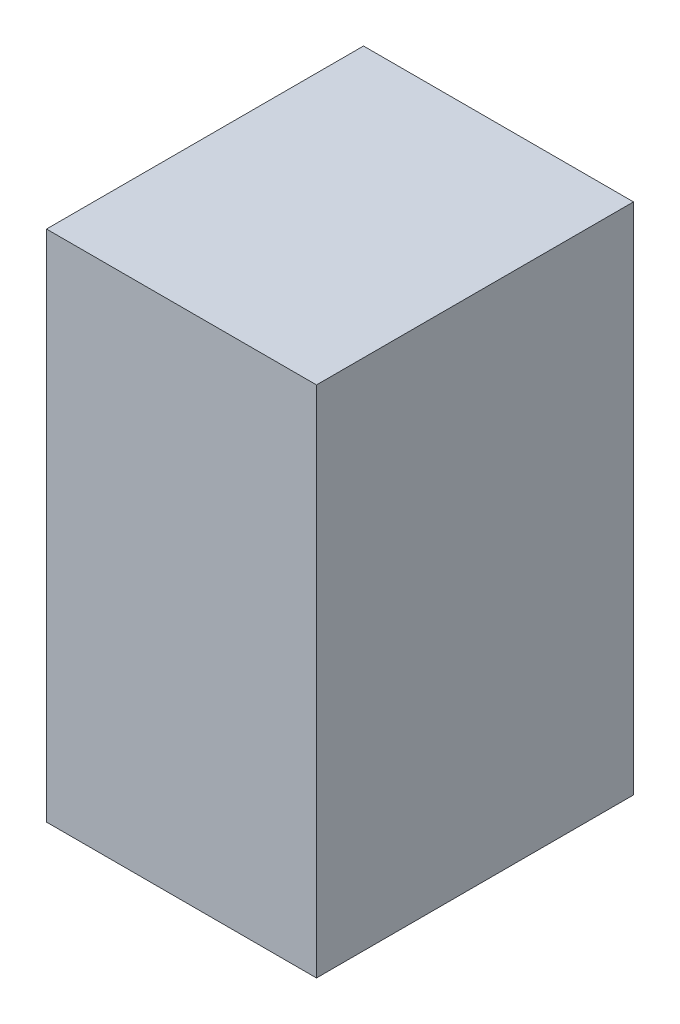
ISO-10303-21;
HEADER;
FILE_DESCRIPTION(('STEP AP214'),'2;1');
FILE_NAME('part.step','',(''),(''),'','','');
FILE_SCHEMA(('AUTOMOTIVE_DESIGN { 1 0 10303 214 1 1 1 1 }'));
ENDSEC;
DATA;
#1=APPLICATION_CONTEXT('core data for automotive mechanical design processes');
#2=APPLICATION_PROTOCOL_DEFINITION('international standard','automotive_design',2000,#1);
#3=PRODUCT_CONTEXT('',#1,'mechanical');
#4=PRODUCT('Part','Part','',(#3));
#5=PRODUCT_RELATED_PRODUCT_CATEGORY('part','',(#4));
#6=PRODUCT_DEFINITION_FORMATION('','',#4);
#7=PRODUCT_DEFINITION_CONTEXT('part definition',#1,'design');
#8=PRODUCT_DEFINITION('design','',#6,#7);
#9=PRODUCT_DEFINITION_SHAPE('','',#8);
#10=(LENGTH_UNIT() NAMED_UNIT(*) SI_UNIT(.MILLI.,.METRE.));
#11=(NAMED_UNIT(*) PLANE_ANGLE_UNIT() SI_UNIT($,.RADIAN.));
#12=(NAMED_UNIT(*) SI_UNIT($,.STERADIAN.) SOLID_ANGLE_UNIT());
#13=UNCERTAINTY_MEASURE_WITH_UNIT(LENGTH_MEASURE(1.E-05),#10,'distance_accuracy_value','');
#14=(GEOMETRIC_REPRESENTATION_CONTEXT(3) GLOBAL_UNCERTAINTY_ASSIGNED_CONTEXT((#13)) GLOBAL_UNIT_ASSIGNED_CONTEXT((#10,
#11,#12)) REPRESENTATION_CONTEXT('',''));
#15=CARTESIAN_POINT('',(0.,0.,0.));
#16=DIRECTION('',(0.,0.,1.));
#17=DIRECTION('',(1.,0.,0.));
#18=AXIS2_PLACEMENT_3D('',#15,#16,#17);
#19=CARTESIAN_POINT('',(35.,33.2917866648596,20.5472745822181));
#20=DIRECTION('',(0.,-1.,0.));
#21=DIRECTION('',(0.,0.,-1.));
#22=AXIS2_PLACEMENT_3D('',#19,#20,#21);
#23=PLANE('',#22);
#24=DIRECTION('',(0.,0.,1.));
#25=VECTOR('',#24,1.);
#26=CARTESIAN_POINT('',(0.,33.2917866648596,20.5472745822181));
#27=LINE('',#26,#25);
#28=CARTESIAN_POINT('',(0.,33.2917866648596,-20.5472745822181));
#29=VERTEX_POINT('',#28);
#30=CARTESIAN_POINT('',(0.,33.2917866648596,20.5472745822181));
#31=VERTEX_POINT('',#30);
#32=EDGE_CURVE('E102',#29,#31,#27,.T.);
#33=ORIENTED_EDGE('',*,*,#32,.T.);
#34=DIRECTION('',(-1.,0.,0.));
#35=VECTOR('',#34,1.);
#36=CARTESIAN_POINT('',(35.,33.2917866648596,20.5472745822181));
#37=LINE('',#36,#35);
#38=CARTESIAN_POINT('',(35.,33.2917866648596,20.5472745822181));
#39=VERTEX_POINT('',#38);
#40=EDGE_CURVE('E11',#39,#31,#37,.T.);
#41=ORIENTED_EDGE('',*,*,#40,.F.);
#42=DIRECTION('',(0.,0.,1.));
#43=VECTOR('',#42,1.);
#44=CARTESIAN_POINT('',(35.,33.2917866648596,20.5472745822181));
#45=LINE('',#44,#43);
#46=CARTESIAN_POINT('',(35.,33.2917866648596,-20.5472745822181));
#47=VERTEX_POINT('',#46);
#48=EDGE_CURVE('E90',#47,#39,#45,.T.);
#49=ORIENTED_EDGE('',*,*,#48,.F.);
#50=DIRECTION('',(-1.,0.,0.));
#51=VECTOR('',#50,1.);
#52=CARTESIAN_POINT('',(35.,33.2917866648596,-20.5472745822181));
#53=LINE('',#52,#51);
#54=EDGE_CURVE('E98',#47,#29,#53,.T.);
#55=ORIENTED_EDGE('',*,*,#54,.T.);
#56=EDGE_LOOP('',(#33,#41,#49,#55));
#57=FACE_BOUND('',#56,.T.);
#58=ADVANCED_FACE('F39',(#57),#23,.F.);
#59=CARTESIAN_POINT('',(35.,-33.2917866648596,20.5472745822181));
#60=DIRECTION('',(0.,0.,-1.));
#61=DIRECTION('',(-1.,0.,0.));
#62=AXIS2_PLACEMENT_3D('',#59,#60,#61);
#63=PLANE('',#62);
#64=DIRECTION('',(0.,-1.,0.));
#65=VECTOR('',#64,1.);
#66=CARTESIAN_POINT('',(0.,-33.2917866648596,20.5472745822181));
#67=LINE('',#66,#65);
#68=CARTESIAN_POINT('',(0.,-33.2917866648596,20.5472745822181));
#69=VERTEX_POINT('',#68);
#70=EDGE_CURVE('E94',#31,#69,#67,.T.);
#71=ORIENTED_EDGE('',*,*,#70,.T.);
#72=DIRECTION('',(-1.,0.,0.));
#73=VECTOR('',#72,1.);
#74=CARTESIAN_POINT('',(35.,-33.2917866648596,20.5472745822181));
#75=LINE('',#74,#73);
#76=CARTESIAN_POINT('',(35.,-33.2917866648596,20.5472745822181));
#77=VERTEX_POINT('',#76);
#78=EDGE_CURVE('E47',#77,#69,#75,.T.);
#79=ORIENTED_EDGE('',*,*,#78,.F.);
#80=DIRECTION('',(0.,-1.,0.));
#81=VECTOR('',#80,1.);
#82=CARTESIAN_POINT('',(35.,-33.2917866648596,20.5472745822181));
#83=LINE('',#82,#81);
#84=EDGE_CURVE('E85',#39,#77,#83,.T.);
#85=ORIENTED_EDGE('',*,*,#84,.F.);
#86=ORIENTED_EDGE('',*,*,#40,.T.);
#87=EDGE_LOOP('',(#71,#79,#85,#86));
#88=FACE_BOUND('',#87,.T.);
#89=ADVANCED_FACE('F93',(#88),#63,.F.);
#90=CARTESIAN_POINT('',(35.,-33.2917866648596,20.5472745822181));
#91=DIRECTION('',(0.,1.,0.));
#92=DIRECTION('',(0.,0.,1.));
#93=AXIS2_PLACEMENT_3D('',#90,#91,#92);
#94=PLANE('',#93);
#95=DIRECTION('',(0.,0.,-1.));
#96=VECTOR('',#95,1.);
#97=CARTESIAN_POINT('',(0.,-33.2917866648596,20.5472745822181));
#98=LINE('',#97,#96);
#99=CARTESIAN_POINT('',(0.,-33.2917866648596,-20.5472745822181));
#100=VERTEX_POINT('',#99);
#101=EDGE_CURVE('E72',#69,#100,#98,.T.);
#102=ORIENTED_EDGE('',*,*,#101,.T.);
#103=DIRECTION('',(-1.,0.,0.));
#104=VECTOR('',#103,1.);
#105=CARTESIAN_POINT('',(35.,-33.2917866648596,-20.5472745822181));
#106=LINE('',#105,#104);
#107=CARTESIAN_POINT('',(35.,-33.2917866648596,-20.5472745822181));
#108=VERTEX_POINT('',#107);
#109=EDGE_CURVE('E95',#108,#100,#106,.T.);
#110=ORIENTED_EDGE('',*,*,#109,.F.);
#111=DIRECTION('',(0.,0.,-1.));
#112=VECTOR('',#111,1.);
#113=CARTESIAN_POINT('',(35.,-33.2917866648596,20.5472745822181));
#114=LINE('',#113,#112);
#115=EDGE_CURVE('E88',#77,#108,#114,.T.);
#116=ORIENTED_EDGE('',*,*,#115,.F.);
#117=ORIENTED_EDGE('',*,*,#78,.T.);
#118=EDGE_LOOP('',(#102,#110,#116,#117));
#119=FACE_BOUND('',#118,.T.);
#120=ADVANCED_FACE('F96',(#119),#94,.F.);
#121=CARTESIAN_POINT('',(35.,-33.2917866648596,-20.5472745822181));
#122=DIRECTION('',(0.,0.,1.));
#123=DIRECTION('',(1.,0.,0.));
#124=AXIS2_PLACEMENT_3D('',#121,#122,#123);
#125=PLANE('',#124);
#126=DIRECTION('',(0.,1.,0.));
#127=VECTOR('',#126,1.);
#128=CARTESIAN_POINT('',(0.,-33.2917866648596,-20.5472745822181));
#129=LINE('',#128,#127);
#130=EDGE_CURVE('E78',#100,#29,#129,.T.);
#131=ORIENTED_EDGE('',*,*,#130,.T.);
#132=ORIENTED_EDGE('',*,*,#54,.F.);
#133=DIRECTION('',(0.,1.,0.));
#134=VECTOR('',#133,1.);
#135=CARTESIAN_POINT('',(35.,-33.2917866648596,-20.5472745822181));
#136=LINE('',#135,#134);
#137=EDGE_CURVE('E55',#108,#47,#136,.T.);
#138=ORIENTED_EDGE('',*,*,#137,.F.);
#139=ORIENTED_EDGE('',*,*,#109,.T.);
#140=EDGE_LOOP('',(#131,#132,#138,#139));
#141=FACE_BOUND('',#140,.T.);
#142=ADVANCED_FACE('F109',(#141),#125,.F.);
#143=CARTESIAN_POINT('',(35.,0.,0.));
#144=DIRECTION('',(1.,0.,0.));
#145=DIRECTION('',(0.,0.,-1.));
#146=AXIS2_PLACEMENT_3D('',#143,#144,#145);
#147=PLANE('',#146);
#148=ORIENTED_EDGE('',*,*,#48,.T.);
#149=ORIENTED_EDGE('',*,*,#84,.T.);
#150=ORIENTED_EDGE('',*,*,#115,.T.);
#151=ORIENTED_EDGE('',*,*,#137,.T.);
#152=EDGE_LOOP('',(#148,#149,#150,#151));
#153=FACE_BOUND('',#152,.T.);
#154=ADVANCED_FACE('F86',(#153),#147,.T.);
#155=CARTESIAN_POINT('',(0.,0.,0.));
#156=DIRECTION('',(1.,0.,0.));
#157=DIRECTION('',(0.,0.,-1.));
#158=AXIS2_PLACEMENT_3D('',#155,#156,#157);
#159=PLANE('',#158);
#160=ORIENTED_EDGE('',*,*,#32,.F.);
#161=ORIENTED_EDGE('',*,*,#130,.F.);
#162=ORIENTED_EDGE('',*,*,#101,.F.);
#163=ORIENTED_EDGE('',*,*,#70,.F.);
#164=EDGE_LOOP('',(#160,#161,#162,#163));
#165=FACE_BOUND('',#164,.T.);
#166=ADVANCED_FACE('F112',(#165),#159,.F.);
#167=CLOSED_SHELL('',(#58,#89,#120,#142,#154,#166));
#168=MANIFOLD_SOLID_BREP('B2',#167);
#169=ADVANCED_BREP_SHAPE_REPRESENTATION('',(#18,#168),#14);
#170=SHAPE_DEFINITION_REPRESENTATION(#9,#169);
ENDSEC;
END-ISO-10303-21;
